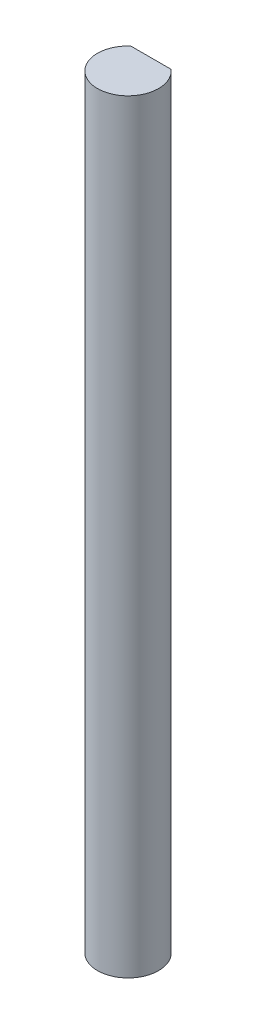
ISO-10303-21;
HEADER;
FILE_DESCRIPTION(('STEP AP214'),'2;1');
FILE_NAME('part.step','',(''),(''),'','','');
FILE_SCHEMA(('AUTOMOTIVE_DESIGN { 1 0 10303 214 1 1 1 1 }'));
ENDSEC;
DATA;
#1=APPLICATION_CONTEXT('core data for automotive mechanical design processes');
#2=APPLICATION_PROTOCOL_DEFINITION('international standard','automotive_design',2000,#1);
#3=PRODUCT_CONTEXT('',#1,'mechanical');
#4=PRODUCT('Part','Part','',(#3));
#5=PRODUCT_RELATED_PRODUCT_CATEGORY('part','',(#4));
#6=PRODUCT_DEFINITION_FORMATION('','',#4);
#7=PRODUCT_DEFINITION_CONTEXT('part definition',#1,'design');
#8=PRODUCT_DEFINITION('design','',#6,#7);
#9=PRODUCT_DEFINITION_SHAPE('','',#8);
#10=(LENGTH_UNIT() NAMED_UNIT(*) SI_UNIT(.MILLI.,.METRE.));
#11=(NAMED_UNIT(*) PLANE_ANGLE_UNIT() SI_UNIT($,.RADIAN.));
#12=(NAMED_UNIT(*) SI_UNIT($,.STERADIAN.) SOLID_ANGLE_UNIT());
#13=UNCERTAINTY_MEASURE_WITH_UNIT(LENGTH_MEASURE(1.E-05),#10,'distance_accuracy_value','');
#14=(GEOMETRIC_REPRESENTATION_CONTEXT(3) GLOBAL_UNCERTAINTY_ASSIGNED_CONTEXT((#13)) GLOBAL_UNIT_ASSIGNED_CONTEXT((#10,
#11,#12)) REPRESENTATION_CONTEXT('',''));
#15=CARTESIAN_POINT('',(0.,0.,0.));
#16=DIRECTION('',(0.,0.,1.));
#17=DIRECTION('',(1.,0.,0.));
#18=AXIS2_PLACEMENT_3D('',#15,#16,#17);
#19=CARTESIAN_POINT('',(0.,100.,0.));
#20=DIRECTION('',(0.,-1.,0.));
#21=DIRECTION('',(0.,0.,-1.));
#22=AXIS2_PLACEMENT_3D('',#19,#20,#21);
#23=CYLINDRICAL_SURFACE('',#22,4.);
#24=CARTESIAN_POINT('',(0.,0.,0.));
#25=DIRECTION('',(0.,1.,0.));
#26=DIRECTION('',(0.,0.,1.));
#27=AXIS2_PLACEMENT_3D('',#24,#25,#26);
#28=CIRCLE('',#27,4.);
#29=CARTESIAN_POINT('',(-2.64575131106459,0.,-3.));
#30=VERTEX_POINT('',#29);
#31=CARTESIAN_POINT('',(2.64575131106459,0.,-3.));
#32=VERTEX_POINT('',#31);
#33=EDGE_CURVE('E60',#30,#32,#28,.T.);
#34=ORIENTED_EDGE('',*,*,#33,.T.);
#35=DIRECTION('',(0.,-1.,0.));
#36=VECTOR('',#35,1.);
#37=CARTESIAN_POINT('',(2.64575131106459,100.,-3.));
#38=LINE('',#37,#36);
#39=CARTESIAN_POINT('',(2.64575131106459,100.,-3.));
#40=VERTEX_POINT('',#39);
#41=EDGE_CURVE('E11',#40,#32,#38,.T.);
#42=ORIENTED_EDGE('',*,*,#41,.F.);
#43=CARTESIAN_POINT('',(0.,100.,0.));
#44=DIRECTION('',(0.,1.,0.));
#45=DIRECTION('',(0.,0.,1.));
#46=AXIS2_PLACEMENT_3D('',#43,#44,#45);
#47=CIRCLE('',#46,4.);
#48=CARTESIAN_POINT('',(-2.64575131106459,100.,-3.));
#49=VERTEX_POINT('',#48);
#50=EDGE_CURVE('E62',#49,#40,#47,.T.);
#51=ORIENTED_EDGE('',*,*,#50,.F.);
#52=DIRECTION('',(0.,-1.,0.));
#53=VECTOR('',#52,1.);
#54=CARTESIAN_POINT('',(-2.64575131106459,100.,-3.));
#55=LINE('',#54,#53);
#56=EDGE_CURVE('E44',#49,#30,#55,.T.);
#57=ORIENTED_EDGE('',*,*,#56,.T.);
#58=EDGE_LOOP('',(#34,#42,#51,#57));
#59=FACE_BOUND('',#58,.T.);
#60=ADVANCED_FACE('F36',(#59),#23,.T.);
#61=CARTESIAN_POINT('',(0.,100.,-3.));
#62=DIRECTION('',(0.,0.,-1.));
#63=DIRECTION('',(-1.,0.,0.));
#64=AXIS2_PLACEMENT_3D('',#61,#62,#63);
#65=PLANE('',#64);
#66=DIRECTION('',(1.,0.,0.));
#67=VECTOR('',#66,1.);
#68=CARTESIAN_POINT('',(0.,0.,-3.));
#69=LINE('',#68,#67);
#70=EDGE_CURVE('E67',#30,#32,#69,.T.);
#71=ORIENTED_EDGE('',*,*,#70,.F.);
#72=ORIENTED_EDGE('',*,*,#56,.F.);
#73=DIRECTION('',(1.,0.,0.));
#74=VECTOR('',#73,1.);
#75=CARTESIAN_POINT('',(0.,100.,-3.));
#76=LINE('',#75,#74);
#77=EDGE_CURVE('E64',#49,#40,#76,.T.);
#78=ORIENTED_EDGE('',*,*,#77,.T.);
#79=ORIENTED_EDGE('',*,*,#41,.T.);
#80=EDGE_LOOP('',(#71,#72,#78,#79));
#81=FACE_BOUND('',#80,.T.);
#82=ADVANCED_FACE('F69',(#81),#65,.T.);
#83=CARTESIAN_POINT('',(0.,100.,0.));
#84=DIRECTION('',(0.,1.,0.));
#85=DIRECTION('',(0.,0.,1.));
#86=AXIS2_PLACEMENT_3D('',#83,#84,#85);
#87=PLANE('',#86);
#88=ORIENTED_EDGE('',*,*,#50,.T.);
#89=ORIENTED_EDGE('',*,*,#77,.F.);
#90=EDGE_LOOP('',(#88,#89));
#91=FACE_BOUND('',#90,.T.);
#92=ADVANCED_FACE('F74',(#91),#87,.T.);
#93=CARTESIAN_POINT('',(0.,0.,0.));
#94=DIRECTION('',(0.,1.,0.));
#95=DIRECTION('',(0.,0.,1.));
#96=AXIS2_PLACEMENT_3D('',#93,#94,#95);
#97=PLANE('',#96);
#98=ORIENTED_EDGE('',*,*,#33,.F.);
#99=ORIENTED_EDGE('',*,*,#70,.T.);
#100=EDGE_LOOP('',(#98,#99));
#101=FACE_BOUND('',#100,.T.);
#102=ADVANCED_FACE('F66',(#101),#97,.F.);
#103=CLOSED_SHELL('',(#60,#82,#92,#102));
#104=MANIFOLD_SOLID_BREP('B2',#103);
#105=ADVANCED_BREP_SHAPE_REPRESENTATION('',(#18,#104),#14);
#106=SHAPE_DEFINITION_REPRESENTATION(#9,#105);
ENDSEC;
END-ISO-10303-21;
